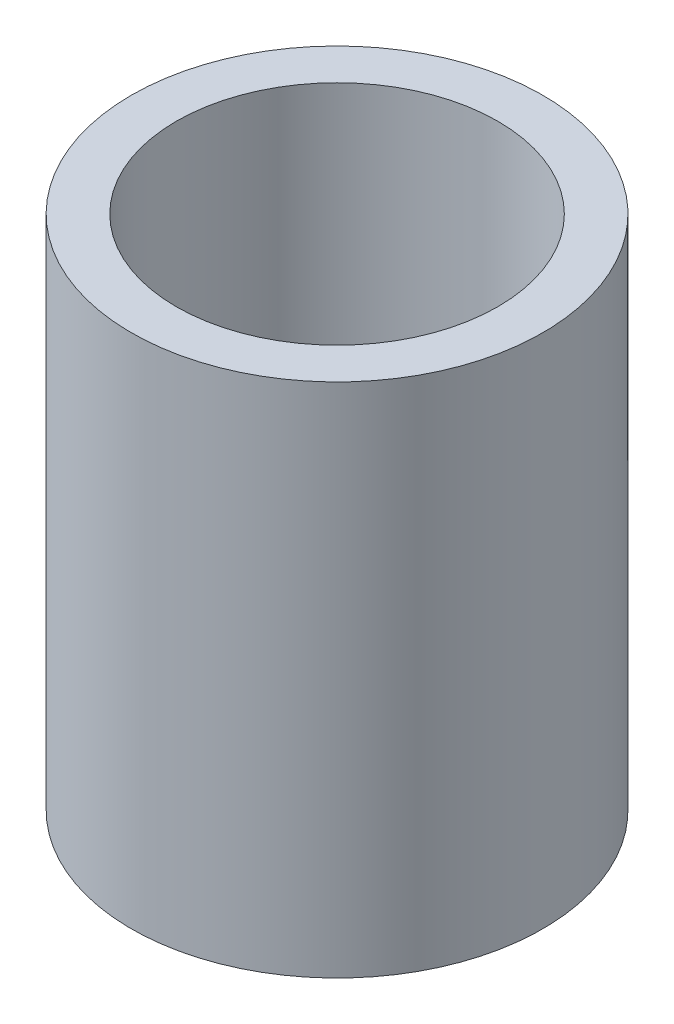
ISO-10303-21;
HEADER;
FILE_DESCRIPTION(('STEP AP214'),'2;1');
FILE_NAME('part.step','',(''),(''),'','','');
FILE_SCHEMA(('AUTOMOTIVE_DESIGN { 1 0 10303 214 1 1 1 1 }'));
ENDSEC;
DATA;
#1=APPLICATION_CONTEXT('core data for automotive mechanical design processes');
#2=APPLICATION_PROTOCOL_DEFINITION('international standard','automotive_design',2000,#1);
#3=PRODUCT_CONTEXT('',#1,'mechanical');
#4=PRODUCT('Part','Part','',(#3));
#5=PRODUCT_RELATED_PRODUCT_CATEGORY('part','',(#4));
#6=PRODUCT_DEFINITION_FORMATION('','',#4);
#7=PRODUCT_DEFINITION_CONTEXT('part definition',#1,'design');
#8=PRODUCT_DEFINITION('design','',#6,#7);
#9=PRODUCT_DEFINITION_SHAPE('','',#8);
#10=(LENGTH_UNIT() NAMED_UNIT(*) SI_UNIT(.MILLI.,.METRE.));
#11=(NAMED_UNIT(*) PLANE_ANGLE_UNIT() SI_UNIT($,.RADIAN.));
#12=(NAMED_UNIT(*) SI_UNIT($,.STERADIAN.) SOLID_ANGLE_UNIT());
#13=UNCERTAINTY_MEASURE_WITH_UNIT(LENGTH_MEASURE(1.E-05),#10,'distance_accuracy_value','');
#14=(GEOMETRIC_REPRESENTATION_CONTEXT(3) GLOBAL_UNCERTAINTY_ASSIGNED_CONTEXT((#13)) GLOBAL_UNIT_ASSIGNED_CONTEXT((#10,
#11,#12)) REPRESENTATION_CONTEXT('',''));
#15=CARTESIAN_POINT('',(0.,0.,0.));
#16=DIRECTION('',(0.,0.,1.));
#17=DIRECTION('',(1.,0.,0.));
#18=AXIS2_PLACEMENT_3D('',#15,#16,#17);
#19=CARTESIAN_POINT('',(0.,1.26052908236606,0.));
#20=DIRECTION('',(0.,-1.,0.));
#21=DIRECTION('',(1.,0.,0.));
#22=AXIS2_PLACEMENT_3D('',#19,#20,#21);
#23=PLANE('',#22);
#24=CARTESIAN_POINT('',(0.,1.26052908236606,0.));
#25=DIRECTION('',(0.,-1.,0.));
#26=DIRECTION('',(1.,0.,0.));
#27=AXIS2_PLACEMENT_3D('',#24,#25,#26);
#28=CIRCLE('',#27,12.5);
#29=CARTESIAN_POINT('',(12.5,1.26052908236606,0.));
#30=VERTEX_POINT('',#29);
#31=EDGE_CURVE('E55',#30,#30,#28,.T.);
#32=ORIENTED_EDGE('',*,*,#31,.T.);
#33=EDGE_LOOP('',(#32));
#34=FACE_BOUND('',#33,.T.);
#35=CARTESIAN_POINT('',(0.,1.26052908236606,0.));
#36=DIRECTION('',(0.,1.,0.));
#37=DIRECTION('',(-1.,0.,0.));
#38=AXIS2_PLACEMENT_3D('',#35,#36,#37);
#39=CIRCLE('',#38,16.);
#40=CARTESIAN_POINT('',(-16.,1.26052908236606,0.));
#41=VERTEX_POINT('',#40);
#42=EDGE_CURVE('E10',#41,#41,#39,.T.);
#43=ORIENTED_EDGE('',*,*,#42,.T.);
#44=EDGE_LOOP('',(#43));
#45=FACE_BOUND('',#44,.T.);
#46=ADVANCED_FACE('F43',(#34,#45),#23,.F.);
#47=CARTESIAN_POINT('',(0.,1.26052908236606,0.));
#48=DIRECTION('',(0.,1.,0.));
#49=DIRECTION('',(-1.,0.,0.));
#50=AXIS2_PLACEMENT_3D('',#47,#48,#49);
#51=CYLINDRICAL_SURFACE('',#50,16.);
#52=ORIENTED_EDGE('',*,*,#42,.F.);
#53=EDGE_LOOP('',(#52));
#54=FACE_BOUND('',#53,.T.);
#55=CARTESIAN_POINT('',(0.,-38.8894709176339,0.));
#56=DIRECTION('',(0.,1.,0.));
#57=DIRECTION('',(-1.,0.,0.));
#58=AXIS2_PLACEMENT_3D('',#55,#56,#57);
#59=CIRCLE('',#58,16.);
#60=CARTESIAN_POINT('',(-16.,-38.8894709176339,0.));
#61=VERTEX_POINT('',#60);
#62=EDGE_CURVE('E50',#61,#61,#59,.T.);
#63=ORIENTED_EDGE('',*,*,#62,.T.);
#64=EDGE_LOOP('',(#63));
#65=FACE_BOUND('',#64,.T.);
#66=ADVANCED_FACE('F77',(#54,#65),#51,.T.);
#67=CARTESIAN_POINT('',(16.,-38.8894709176339,0.));
#68=DIRECTION('',(0.,1.,0.));
#69=DIRECTION('',(-1.,0.,0.));
#70=AXIS2_PLACEMENT_3D('',#67,#68,#69);
#71=PLANE('',#70);
#72=CARTESIAN_POINT('',(0.,-38.8894709176339,0.));
#73=DIRECTION('',(0.,1.,0.));
#74=DIRECTION('',(-1.,0.,0.));
#75=AXIS2_PLACEMENT_3D('',#72,#73,#74);
#76=CIRCLE('',#75,12.5);
#77=CARTESIAN_POINT('',(-12.5,-38.8894709176339,0.));
#78=VERTEX_POINT('',#77);
#79=EDGE_CURVE('E60',#78,#78,#76,.T.);
#80=ORIENTED_EDGE('',*,*,#79,.T.);
#81=EDGE_LOOP('',(#80));
#82=FACE_BOUND('',#81,.T.);
#83=ORIENTED_EDGE('',*,*,#62,.F.);
#84=EDGE_LOOP('',(#83));
#85=FACE_BOUND('',#84,.T.);
#86=ADVANCED_FACE('F67',(#82,#85),#71,.F.);
#87=CARTESIAN_POINT('',(0.,-38.8894709176339,0.));
#88=DIRECTION('',(0.,1.,0.));
#89=DIRECTION('',(-1.,0.,0.));
#90=AXIS2_PLACEMENT_3D('',#87,#88,#89);
#91=CYLINDRICAL_SURFACE('',#90,12.5);
#92=ORIENTED_EDGE('',*,*,#79,.F.);
#93=EDGE_LOOP('',(#92));
#94=FACE_BOUND('',#93,.T.);
#95=ORIENTED_EDGE('',*,*,#31,.F.);
#96=EDGE_LOOP('',(#95));
#97=FACE_BOUND('',#96,.T.);
#98=ADVANCED_FACE('F70',(#94,#97),#91,.F.);
#99=CLOSED_SHELL('',(#46,#66,#86,#98));
#100=MANIFOLD_SOLID_BREP('B2',#99);
#101=ADVANCED_BREP_SHAPE_REPRESENTATION('',(#18,#100),#14);
#102=SHAPE_DEFINITION_REPRESENTATION(#9,#101);
ENDSEC;
END-ISO-10303-21;
